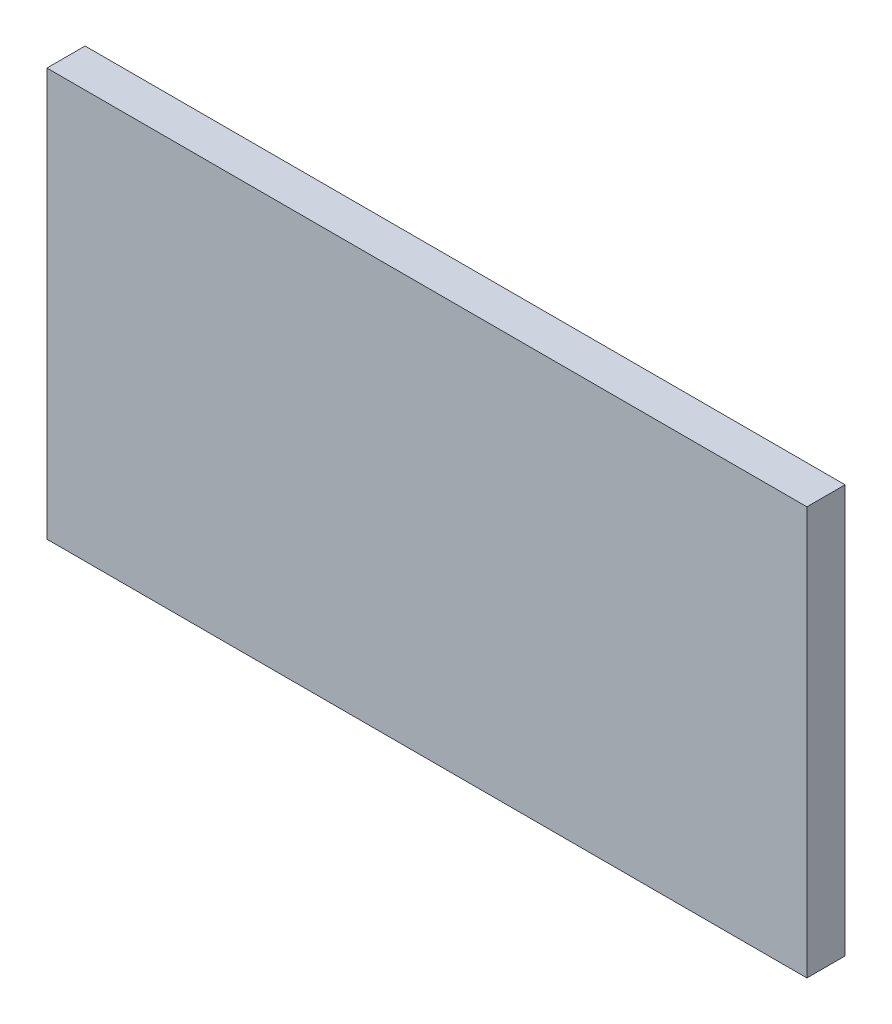
ISO-10303-21;
HEADER;
FILE_DESCRIPTION(('STEP AP214'),'2;1');
FILE_NAME('part.step','',(''),(''),'','','');
FILE_SCHEMA(('AUTOMOTIVE_DESIGN { 1 0 10303 214 1 1 1 1 }'));
ENDSEC;
DATA;
#1=APPLICATION_CONTEXT('core data for automotive mechanical design processes');
#2=APPLICATION_PROTOCOL_DEFINITION('international standard','automotive_design',2000,#1);
#3=PRODUCT_CONTEXT('',#1,'mechanical');
#4=PRODUCT('Part','Part','',(#3));
#5=PRODUCT_RELATED_PRODUCT_CATEGORY('part','',(#4));
#6=PRODUCT_DEFINITION_FORMATION('','',#4);
#7=PRODUCT_DEFINITION_CONTEXT('part definition',#1,'design');
#8=PRODUCT_DEFINITION('design','',#6,#7);
#9=PRODUCT_DEFINITION_SHAPE('','',#8);
#10=(LENGTH_UNIT() NAMED_UNIT(*) SI_UNIT(.MILLI.,.METRE.));
#11=(NAMED_UNIT(*) PLANE_ANGLE_UNIT() SI_UNIT($,.RADIAN.));
#12=(NAMED_UNIT(*) SI_UNIT($,.STERADIAN.) SOLID_ANGLE_UNIT());
#13=UNCERTAINTY_MEASURE_WITH_UNIT(LENGTH_MEASURE(1.E-05),#10,'distance_accuracy_value','');
#14=(GEOMETRIC_REPRESENTATION_CONTEXT(3) GLOBAL_UNCERTAINTY_ASSIGNED_CONTEXT((#13)) GLOBAL_UNIT_ASSIGNED_CONTEXT((#10,
#11,#12)) REPRESENTATION_CONTEXT('',''));
#15=CARTESIAN_POINT('',(0.,0.,0.));
#16=DIRECTION('',(0.,0.,1.));
#17=DIRECTION('',(1.,0.,0.));
#18=AXIS2_PLACEMENT_3D('',#15,#16,#17);
#19=CARTESIAN_POINT('',(-26.8651315887866,13.8335379076588,3.));
#20=DIRECTION('',(1.,0.,0.));
#21=DIRECTION('',(0.,0.,-1.));
#22=AXIS2_PLACEMENT_3D('',#19,#20,#21);
#23=PLANE('',#22);
#24=DIRECTION('',(0.,-1.,0.));
#25=VECTOR('',#24,1.);
#26=CARTESIAN_POINT('',(-26.8651315887866,13.8335379076588,0.));
#27=LINE('',#26,#25);
#28=CARTESIAN_POINT('',(-26.8651315887866,13.8335379076588,0.));
#29=VERTEX_POINT('',#28);
#30=CARTESIAN_POINT('',(-26.8651315887866,-18.2442311535789,0.));
#31=VERTEX_POINT('',#30);
#32=EDGE_CURVE('E96',#29,#31,#27,.T.);
#33=ORIENTED_EDGE('',*,*,#32,.T.);
#34=DIRECTION('',(0.,0.,-1.));
#35=VECTOR('',#34,1.);
#36=CARTESIAN_POINT('',(-26.8651315887866,-18.2442311535789,3.));
#37=LINE('',#36,#35);
#38=CARTESIAN_POINT('',(-26.8651315887866,-18.2442311535789,3.));
#39=VERTEX_POINT('',#38);
#40=EDGE_CURVE('E11',#39,#31,#37,.T.);
#41=ORIENTED_EDGE('',*,*,#40,.F.);
#42=DIRECTION('',(0.,-1.,0.));
#43=VECTOR('',#42,1.);
#44=CARTESIAN_POINT('',(-26.8651315887866,13.8335379076588,3.));
#45=LINE('',#44,#43);
#46=CARTESIAN_POINT('',(-26.8651315887866,13.8335379076588,3.));
#47=VERTEX_POINT('',#46);
#48=EDGE_CURVE('E84',#47,#39,#45,.T.);
#49=ORIENTED_EDGE('',*,*,#48,.F.);
#50=DIRECTION('',(0.,0.,-1.));
#51=VECTOR('',#50,1.);
#52=CARTESIAN_POINT('',(-26.8651315887866,13.8335379076588,3.));
#53=LINE('',#52,#51);
#54=EDGE_CURVE('E92',#47,#29,#53,.T.);
#55=ORIENTED_EDGE('',*,*,#54,.T.);
#56=EDGE_LOOP('',(#33,#41,#49,#55));
#57=FACE_BOUND('',#56,.T.);
#58=ADVANCED_FACE('F33',(#57),#23,.F.);
#59=CARTESIAN_POINT('',(-26.8651315887866,-18.2442311535789,3.));
#60=DIRECTION('',(0.,1.,0.));
#61=DIRECTION('',(0.,0.,1.));
#62=AXIS2_PLACEMENT_3D('',#59,#60,#61);
#63=PLANE('',#62);
#64=DIRECTION('',(1.,0.,0.));
#65=VECTOR('',#64,1.);
#66=CARTESIAN_POINT('',(-26.8651315887866,-18.2442311535789,0.));
#67=LINE('',#66,#65);
#68=CARTESIAN_POINT('',(32.8797132877687,-18.2442311535789,0.));
#69=VERTEX_POINT('',#68);
#70=EDGE_CURVE('E88',#31,#69,#67,.T.);
#71=ORIENTED_EDGE('',*,*,#70,.T.);
#72=DIRECTION('',(0.,0.,-1.));
#73=VECTOR('',#72,1.);
#74=CARTESIAN_POINT('',(32.8797132877687,-18.2442311535789,3.));
#75=LINE('',#74,#73);
#76=CARTESIAN_POINT('',(32.8797132877687,-18.2442311535789,3.));
#77=VERTEX_POINT('',#76);
#78=EDGE_CURVE('E41',#77,#69,#75,.T.);
#79=ORIENTED_EDGE('',*,*,#78,.F.);
#80=DIRECTION('',(1.,0.,0.));
#81=VECTOR('',#80,1.);
#82=CARTESIAN_POINT('',(-26.8651315887866,-18.2442311535789,3.));
#83=LINE('',#82,#81);
#84=EDGE_CURVE('E79',#39,#77,#83,.T.);
#85=ORIENTED_EDGE('',*,*,#84,.F.);
#86=ORIENTED_EDGE('',*,*,#40,.T.);
#87=EDGE_LOOP('',(#71,#79,#85,#86));
#88=FACE_BOUND('',#87,.T.);
#89=ADVANCED_FACE('F87',(#88),#63,.F.);
#90=CARTESIAN_POINT('',(32.8797132877687,13.8335379076588,3.));
#91=DIRECTION('',(-1.,0.,0.));
#92=DIRECTION('',(0.,0.,1.));
#93=AXIS2_PLACEMENT_3D('',#90,#91,#92);
#94=PLANE('',#93);
#95=DIRECTION('',(0.,1.,0.));
#96=VECTOR('',#95,1.);
#97=CARTESIAN_POINT('',(32.8797132877687,13.8335379076588,0.));
#98=LINE('',#97,#96);
#99=CARTESIAN_POINT('',(32.8797132877687,13.8335379076588,0.));
#100=VERTEX_POINT('',#99);
#101=EDGE_CURVE('E66',#69,#100,#98,.T.);
#102=ORIENTED_EDGE('',*,*,#101,.T.);
#103=DIRECTION('',(0.,0.,-1.));
#104=VECTOR('',#103,1.);
#105=CARTESIAN_POINT('',(32.8797132877687,13.8335379076588,3.));
#106=LINE('',#105,#104);
#107=CARTESIAN_POINT('',(32.8797132877687,13.8335379076588,3.));
#108=VERTEX_POINT('',#107);
#109=EDGE_CURVE('E89',#108,#100,#106,.T.);
#110=ORIENTED_EDGE('',*,*,#109,.F.);
#111=DIRECTION('',(0.,1.,0.));
#112=VECTOR('',#111,1.);
#113=CARTESIAN_POINT('',(32.8797132877687,13.8335379076588,3.));
#114=LINE('',#113,#112);
#115=EDGE_CURVE('E82',#77,#108,#114,.T.);
#116=ORIENTED_EDGE('',*,*,#115,.F.);
#117=ORIENTED_EDGE('',*,*,#78,.T.);
#118=EDGE_LOOP('',(#102,#110,#116,#117));
#119=FACE_BOUND('',#118,.T.);
#120=ADVANCED_FACE('F90',(#119),#94,.F.);
#121=CARTESIAN_POINT('',(-26.8651315887866,13.8335379076588,3.));
#122=DIRECTION('',(0.,-1.,0.));
#123=DIRECTION('',(0.,0.,-1.));
#124=AXIS2_PLACEMENT_3D('',#121,#122,#123);
#125=PLANE('',#124);
#126=DIRECTION('',(-1.,0.,0.));
#127=VECTOR('',#126,1.);
#128=CARTESIAN_POINT('',(-26.8651315887866,13.8335379076588,0.));
#129=LINE('',#128,#127);
#130=EDGE_CURVE('E72',#100,#29,#129,.T.);
#131=ORIENTED_EDGE('',*,*,#130,.T.);
#132=ORIENTED_EDGE('',*,*,#54,.F.);
#133=DIRECTION('',(-1.,0.,0.));
#134=VECTOR('',#133,1.);
#135=CARTESIAN_POINT('',(-26.8651315887866,13.8335379076588,3.));
#136=LINE('',#135,#134);
#137=EDGE_CURVE('E49',#108,#47,#136,.T.);
#138=ORIENTED_EDGE('',*,*,#137,.F.);
#139=ORIENTED_EDGE('',*,*,#109,.T.);
#140=EDGE_LOOP('',(#131,#132,#138,#139));
#141=FACE_BOUND('',#140,.T.);
#142=ADVANCED_FACE('F103',(#141),#125,.F.);
#143=CARTESIAN_POINT('',(0.,0.,3.));
#144=DIRECTION('',(0.,0.,1.));
#145=DIRECTION('',(1.,0.,0.));
#146=AXIS2_PLACEMENT_3D('',#143,#144,#145);
#147=PLANE('',#146);
#148=ORIENTED_EDGE('',*,*,#48,.T.);
#149=ORIENTED_EDGE('',*,*,#84,.T.);
#150=ORIENTED_EDGE('',*,*,#115,.T.);
#151=ORIENTED_EDGE('',*,*,#137,.T.);
#152=EDGE_LOOP('',(#148,#149,#150,#151));
#153=FACE_BOUND('',#152,.T.);
#154=ADVANCED_FACE('F80',(#153),#147,.T.);
#155=CARTESIAN_POINT('',(0.,0.,0.));
#156=DIRECTION('',(0.,0.,1.));
#157=DIRECTION('',(1.,0.,0.));
#158=AXIS2_PLACEMENT_3D('',#155,#156,#157);
#159=PLANE('',#158);
#160=ORIENTED_EDGE('',*,*,#32,.F.);
#161=ORIENTED_EDGE('',*,*,#130,.F.);
#162=ORIENTED_EDGE('',*,*,#101,.F.);
#163=ORIENTED_EDGE('',*,*,#70,.F.);
#164=EDGE_LOOP('',(#160,#161,#162,#163));
#165=FACE_BOUND('',#164,.T.);
#166=ADVANCED_FACE('F106',(#165),#159,.F.);
#167=CLOSED_SHELL('',(#58,#89,#120,#142,#154,#166));
#168=MANIFOLD_SOLID_BREP('B2',#167);
#169=ADVANCED_BREP_SHAPE_REPRESENTATION('',(#18,#168),#14);
#170=SHAPE_DEFINITION_REPRESENTATION(#9,#169);
ENDSEC;
END-ISO-10303-21;
